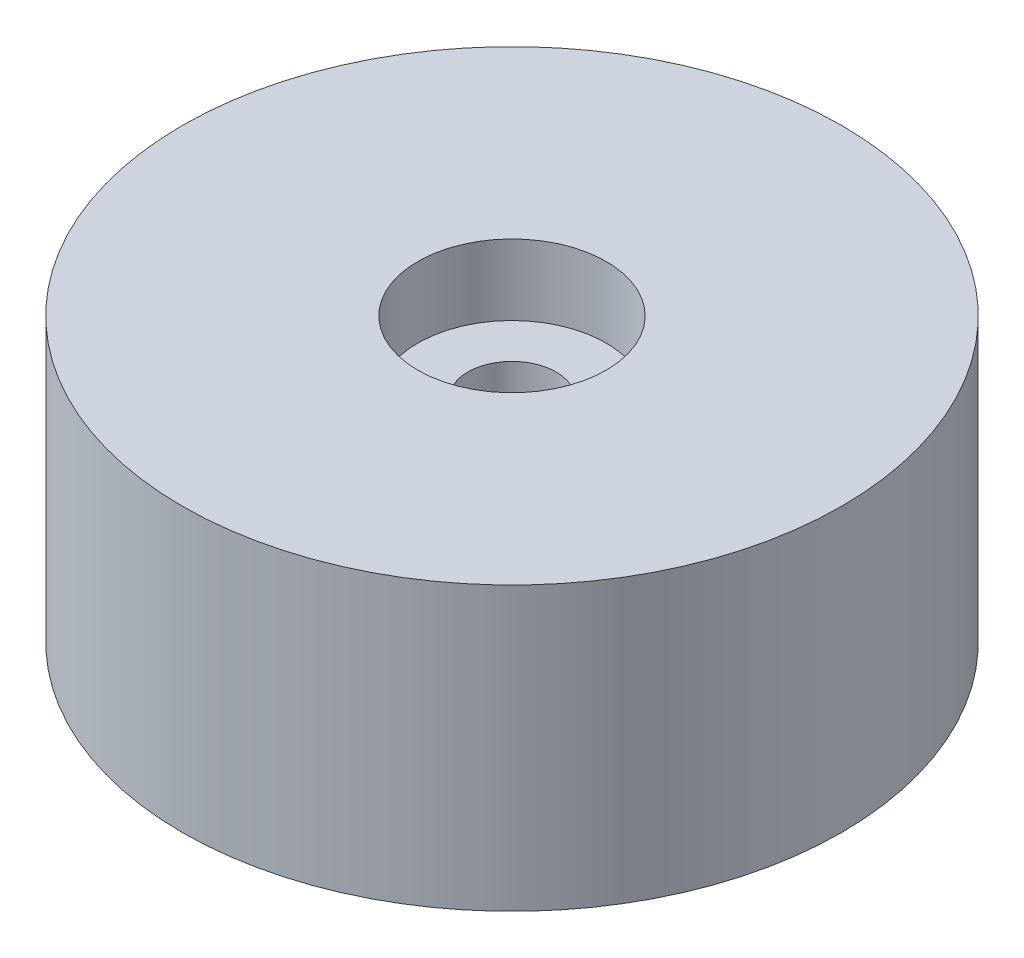
ISO-10303-21;
HEADER;
FILE_DESCRIPTION(('STEP AP214'),'2;1');
FILE_NAME('part.step','',(''),(''),'','','');
FILE_SCHEMA(('AUTOMOTIVE_DESIGN { 1 0 10303 214 1 1 1 1 }'));
ENDSEC;
DATA;
#1=APPLICATION_CONTEXT('core data for automotive mechanical design processes');
#2=APPLICATION_PROTOCOL_DEFINITION('international standard','automotive_design',2000,#1);
#3=PRODUCT_CONTEXT('',#1,'mechanical');
#4=PRODUCT('Part','Part','',(#3));
#5=PRODUCT_RELATED_PRODUCT_CATEGORY('part','',(#4));
#6=PRODUCT_DEFINITION_FORMATION('','',#4);
#7=PRODUCT_DEFINITION_CONTEXT('part definition',#1,'design');
#8=PRODUCT_DEFINITION('design','',#6,#7);
#9=PRODUCT_DEFINITION_SHAPE('','',#8);
#10=(LENGTH_UNIT() NAMED_UNIT(*) SI_UNIT(.MILLI.,.METRE.));
#11=(NAMED_UNIT(*) PLANE_ANGLE_UNIT() SI_UNIT($,.RADIAN.));
#12=(NAMED_UNIT(*) SI_UNIT($,.STERADIAN.) SOLID_ANGLE_UNIT());
#13=UNCERTAINTY_MEASURE_WITH_UNIT(LENGTH_MEASURE(1.E-05),#10,'distance_accuracy_value','');
#14=(GEOMETRIC_REPRESENTATION_CONTEXT(3) GLOBAL_UNCERTAINTY_ASSIGNED_CONTEXT((#13)) GLOBAL_UNIT_ASSIGNED_CONTEXT((#10,
#11,#12)) REPRESENTATION_CONTEXT('',''));
#15=CARTESIAN_POINT('',(0.,0.,0.));
#16=DIRECTION('',(0.,0.,1.));
#17=DIRECTION('',(1.,0.,0.));
#18=AXIS2_PLACEMENT_3D('',#15,#16,#17);
#19=CARTESIAN_POINT('',(0.,0.,0.));
#20=DIRECTION('',(0.,1.,0.));
#21=DIRECTION('',(0.,0.,1.));
#22=AXIS2_PLACEMENT_3D('',#19,#20,#21);
#23=CYLINDRICAL_SURFACE('',#22,0.75);
#24=CARTESIAN_POINT('',(0.,1.2,0.));
#25=DIRECTION('',(0.,1.,0.));
#26=DIRECTION('',(0.,0.,1.));
#27=AXIS2_PLACEMENT_3D('',#24,#25,#26);
#28=CIRCLE('',#27,0.75);
#29=CARTESIAN_POINT('',(0.,1.2,0.75));
#30=VERTEX_POINT('',#29);
#31=EDGE_CURVE('E38',#30,#30,#28,.F.);
#32=ORIENTED_EDGE('',*,*,#31,.T.);
#33=EDGE_LOOP('',(#32));
#34=FACE_BOUND('',#33,.T.);
#35=CARTESIAN_POINT('',(0.,3.6,0.));
#36=DIRECTION('',(0.,1.,0.));
#37=DIRECTION('',(0.,0.,1.));
#38=AXIS2_PLACEMENT_3D('',#35,#36,#37);
#39=CIRCLE('',#38,0.75);
#40=CARTESIAN_POINT('',(0.,3.6,0.75));
#41=VERTEX_POINT('',#40);
#42=EDGE_CURVE('E47',#41,#41,#39,.F.);
#43=ORIENTED_EDGE('',*,*,#42,.F.);
#44=EDGE_LOOP('',(#43));
#45=FACE_BOUND('',#44,.T.);
#46=ADVANCED_FACE('F34',(#34,#45),#23,.F.);
#47=CARTESIAN_POINT('',(0.,4.8,0.));
#48=DIRECTION('',(0.,-1.,0.));
#49=DIRECTION('',(0.,0.,-1.));
#50=AXIS2_PLACEMENT_3D('',#47,#48,#49);
#51=CYLINDRICAL_SURFACE('',#50,5.6);
#52=CARTESIAN_POINT('',(0.,4.8,0.));
#53=DIRECTION('',(0.,1.,0.));
#54=DIRECTION('',(0.,0.,1.));
#55=AXIS2_PLACEMENT_3D('',#52,#53,#54);
#56=CIRCLE('',#55,5.6);
#57=CARTESIAN_POINT('',(0.,4.8,5.6));
#58=VERTEX_POINT('',#57);
#59=EDGE_CURVE('E10',#58,#58,#56,.T.);
#60=ORIENTED_EDGE('',*,*,#59,.F.);
#61=EDGE_LOOP('',(#60));
#62=FACE_BOUND('',#61,.T.);
#63=CARTESIAN_POINT('',(0.,0.,0.));
#64=DIRECTION('',(0.,1.,0.));
#65=DIRECTION('',(0.,0.,1.));
#66=AXIS2_PLACEMENT_3D('',#63,#64,#65);
#67=CIRCLE('',#66,5.6);
#68=CARTESIAN_POINT('',(0.,0.,5.6));
#69=VERTEX_POINT('',#68);
#70=EDGE_CURVE('E42',#69,#69,#67,.T.);
#71=ORIENTED_EDGE('',*,*,#70,.T.);
#72=EDGE_LOOP('',(#71));
#73=FACE_BOUND('',#72,.T.);
#74=ADVANCED_FACE('F36',(#62,#73),#51,.T.);
#75=CARTESIAN_POINT('',(0.,4.8,0.));
#76=DIRECTION('',(0.,1.,0.));
#77=DIRECTION('',(0.,0.,1.));
#78=AXIS2_PLACEMENT_3D('',#75,#76,#77);
#79=PLANE('',#78);
#80=CARTESIAN_POINT('',(0.,4.8,0.));
#81=DIRECTION('',(0.,1.,0.));
#82=DIRECTION('',(0.,0.,1.));
#83=AXIS2_PLACEMENT_3D('',#80,#81,#82);
#84=CIRCLE('',#83,1.6);
#85=CARTESIAN_POINT('',(0.,4.8,1.6));
#86=VERTEX_POINT('',#85);
#87=EDGE_CURVE('E50',#86,#86,#84,.T.);
#88=ORIENTED_EDGE('',*,*,#87,.F.);
#89=EDGE_LOOP('',(#88));
#90=FACE_BOUND('',#89,.T.);
#91=ORIENTED_EDGE('',*,*,#59,.T.);
#92=EDGE_LOOP('',(#91));
#93=FACE_BOUND('',#92,.T.);
#94=ADVANCED_FACE('F92',(#90,#93),#79,.T.);
#95=CARTESIAN_POINT('',(0.,0.,0.));
#96=DIRECTION('',(0.,1.,0.));
#97=DIRECTION('',(0.,0.,1.));
#98=AXIS2_PLACEMENT_3D('',#95,#96,#97);
#99=PLANE('',#98);
#100=CARTESIAN_POINT('',(0.,0.,0.));
#101=DIRECTION('',(0.,1.,0.));
#102=DIRECTION('',(0.,0.,1.));
#103=AXIS2_PLACEMENT_3D('',#100,#101,#102);
#104=CIRCLE('',#103,1.6);
#105=CARTESIAN_POINT('',(0.,0.,1.6));
#106=VERTEX_POINT('',#105);
#107=EDGE_CURVE('E61',#106,#106,#104,.T.);
#108=ORIENTED_EDGE('',*,*,#107,.T.);
#109=EDGE_LOOP('',(#108));
#110=FACE_BOUND('',#109,.T.);
#111=ORIENTED_EDGE('',*,*,#70,.F.);
#112=EDGE_LOOP('',(#111));
#113=FACE_BOUND('',#112,.T.);
#114=ADVANCED_FACE('F97',(#110,#113),#99,.F.);
#115=CARTESIAN_POINT('',(0.,3.6,0.));
#116=DIRECTION('',(0.,1.,0.));
#117=DIRECTION('',(0.,0.,1.));
#118=AXIS2_PLACEMENT_3D('',#115,#116,#117);
#119=PLANE('',#118);
#120=CARTESIAN_POINT('',(0.,3.6,0.));
#121=DIRECTION('',(0.,1.,0.));
#122=DIRECTION('',(0.,0.,1.));
#123=AXIS2_PLACEMENT_3D('',#120,#121,#122);
#124=CIRCLE('',#123,1.6);
#125=CARTESIAN_POINT('',(0.,3.6,1.6));
#126=VERTEX_POINT('',#125);
#127=EDGE_CURVE('E53',#126,#126,#124,.T.);
#128=ORIENTED_EDGE('',*,*,#127,.T.);
#129=EDGE_LOOP('',(#128));
#130=FACE_BOUND('',#129,.T.);
#131=ORIENTED_EDGE('',*,*,#42,.T.);
#132=EDGE_LOOP('',(#131));
#133=FACE_BOUND('',#132,.T.);
#134=ADVANCED_FACE('F84',(#130,#133),#119,.T.);
#135=CARTESIAN_POINT('',(0.,3.6,0.));
#136=DIRECTION('',(0.,1.,0.));
#137=DIRECTION('',(0.,0.,1.));
#138=AXIS2_PLACEMENT_3D('',#135,#136,#137);
#139=CYLINDRICAL_SURFACE('',#138,1.6);
#140=ORIENTED_EDGE('',*,*,#127,.F.);
#141=EDGE_LOOP('',(#140));
#142=FACE_BOUND('',#141,.T.);
#143=ORIENTED_EDGE('',*,*,#87,.T.);
#144=EDGE_LOOP('',(#143));
#145=FACE_BOUND('',#144,.T.);
#146=ADVANCED_FACE('F76',(#142,#145),#139,.F.);
#147=CARTESIAN_POINT('',(0.,1.2,0.));
#148=DIRECTION('',(0.,1.,0.));
#149=DIRECTION('',(0.,0.,1.));
#150=AXIS2_PLACEMENT_3D('',#147,#148,#149);
#151=PLANE('',#150);
#152=CARTESIAN_POINT('',(0.,1.2,0.));
#153=DIRECTION('',(0.,1.,0.));
#154=DIRECTION('',(0.,0.,1.));
#155=AXIS2_PLACEMENT_3D('',#152,#153,#154);
#156=CIRCLE('',#155,1.6);
#157=CARTESIAN_POINT('',(0.,1.2,1.6));
#158=VERTEX_POINT('',#157);
#159=EDGE_CURVE('E64',#158,#158,#156,.T.);
#160=ORIENTED_EDGE('',*,*,#159,.F.);
#161=EDGE_LOOP('',(#160));
#162=FACE_BOUND('',#161,.T.);
#163=ORIENTED_EDGE('',*,*,#31,.F.);
#164=EDGE_LOOP('',(#163));
#165=FACE_BOUND('',#164,.T.);
#166=ADVANCED_FACE('F73',(#162,#165),#151,.F.);
#167=CARTESIAN_POINT('',(0.,1.2,0.));
#168=DIRECTION('',(0.,-1.,0.));
#169=DIRECTION('',(0.,0.,-1.));
#170=AXIS2_PLACEMENT_3D('',#167,#168,#169);
#171=CYLINDRICAL_SURFACE('',#170,1.6);
#172=ORIENTED_EDGE('',*,*,#159,.T.);
#173=EDGE_LOOP('',(#172));
#174=FACE_BOUND('',#173,.T.);
#175=ORIENTED_EDGE('',*,*,#107,.F.);
#176=EDGE_LOOP('',(#175));
#177=FACE_BOUND('',#176,.T.);
#178=ADVANCED_FACE('F75',(#174,#177),#171,.F.);
#179=CLOSED_SHELL('',(#46,#74,#94,#114,#134,#146,#166,#178));
#180=MANIFOLD_SOLID_BREP('B2',#179);
#181=ADVANCED_BREP_SHAPE_REPRESENTATION('',(#18,#180),#14);
#182=SHAPE_DEFINITION_REPRESENTATION(#9,#181);
ENDSEC;
END-ISO-10303-21;
